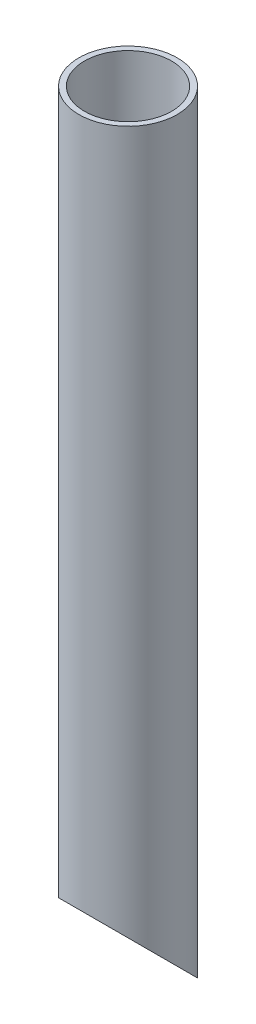
ISO-10303-21;
HEADER;
FILE_DESCRIPTION(('STEP AP214'),'2;1');
FILE_NAME('part.step','',(''),(''),'','','');
FILE_SCHEMA(('AUTOMOTIVE_DESIGN { 1 0 10303 214 1 1 1 1 }'));
ENDSEC;
DATA;
#1=APPLICATION_CONTEXT('core data for automotive mechanical design processes');
#2=APPLICATION_PROTOCOL_DEFINITION('international standard','automotive_design',2000,#1);
#3=PRODUCT_CONTEXT('',#1,'mechanical');
#4=PRODUCT('Part','Part','',(#3));
#5=PRODUCT_RELATED_PRODUCT_CATEGORY('part','',(#4));
#6=PRODUCT_DEFINITION_FORMATION('','',#4);
#7=PRODUCT_DEFINITION_CONTEXT('part definition',#1,'design');
#8=PRODUCT_DEFINITION('design','',#6,#7);
#9=PRODUCT_DEFINITION_SHAPE('','',#8);
#10=(LENGTH_UNIT() NAMED_UNIT(*) SI_UNIT(.MILLI.,.METRE.));
#11=(NAMED_UNIT(*) PLANE_ANGLE_UNIT() SI_UNIT($,.RADIAN.));
#12=(NAMED_UNIT(*) SI_UNIT($,.STERADIAN.) SOLID_ANGLE_UNIT());
#13=UNCERTAINTY_MEASURE_WITH_UNIT(LENGTH_MEASURE(1.E-05),#10,'distance_accuracy_value','');
#14=(GEOMETRIC_REPRESENTATION_CONTEXT(3) GLOBAL_UNCERTAINTY_ASSIGNED_CONTEXT((#13)) GLOBAL_UNIT_ASSIGNED_CONTEXT((#10,
#11,#12)) REPRESENTATION_CONTEXT('',''));
#15=CARTESIAN_POINT('',(0.,0.,0.));
#16=DIRECTION('',(0.,0.,1.));
#17=DIRECTION('',(1.,0.,0.));
#18=AXIS2_PLACEMENT_3D('',#15,#16,#17);
#19=CARTESIAN_POINT('',(0.,304.8,0.));
#20=DIRECTION('',(0.,-1.,0.));
#21=DIRECTION('',(0.,0.,-1.));
#22=AXIS2_PLACEMENT_3D('',#19,#20,#21);
#23=CYLINDRICAL_SURFACE('',#22,16.891);
#24=CARTESIAN_POINT('',(0.,304.8,0.));
#25=DIRECTION('',(0.,1.,0.));
#26=DIRECTION('',(1.,0.,0.));
#27=AXIS2_PLACEMENT_3D('',#24,#25,#26);
#28=CIRCLE('',#27,16.891);
#29=CARTESIAN_POINT('',(16.891,304.8,0.));
#30=VERTEX_POINT('',#29);
#31=EDGE_CURVE('E9',#30,#30,#28,.T.);
#32=ORIENTED_EDGE('',*,*,#31,.T.);
#33=EDGE_LOOP('',(#32));
#34=FACE_BOUND('',#33,.T.);
#35=CARTESIAN_POINT('',(0.,19.0500000000005,0.));
#36=DIRECTION('',(0.,0.707106781186544,-0.707106781186551));
#37=DIRECTION('',(0.,0.707106781186551,0.707106781186544));
#38=AXIS2_PLACEMENT_3D('',#35,#36,#37);
#39=ELLIPSE('',#38,23.8874812820441,16.891);
#40=CARTESIAN_POINT('',(0.,35.9410000000007,16.891));
#41=VERTEX_POINT('',#40);
#42=EDGE_CURVE('E27',#41,#41,#39,.T.);
#43=ORIENTED_EDGE('',*,*,#42,.F.);
#44=EDGE_LOOP('',(#43));
#45=FACE_BOUND('',#44,.T.);
#46=ADVANCED_FACE('F14',(#34,#45),#23,.F.);
#47=CARTESIAN_POINT('',(0.,304.8,0.));
#48=DIRECTION('',(0.,-1.,0.));
#49=DIRECTION('',(0.,0.,-1.));
#50=AXIS2_PLACEMENT_3D('',#47,#48,#49);
#51=CYLINDRICAL_SURFACE('',#50,19.05);
#52=CARTESIAN_POINT('',(0.,304.8,0.));
#53=DIRECTION('',(0.,1.,0.));
#54=DIRECTION('',(1.,0.,0.));
#55=AXIS2_PLACEMENT_3D('',#52,#53,#54);
#56=CIRCLE('',#55,19.05);
#57=CARTESIAN_POINT('',(19.05,304.8,0.));
#58=VERTEX_POINT('',#57);
#59=EDGE_CURVE('E25',#58,#58,#56,.T.);
#60=ORIENTED_EDGE('',*,*,#59,.F.);
#61=EDGE_LOOP('',(#60));
#62=FACE_BOUND('',#61,.T.);
#63=CARTESIAN_POINT('',(0.,19.0500000000005,0.));
#64=DIRECTION('',(0.,0.707106781186544,-0.707106781186551));
#65=DIRECTION('',(0.,0.707106781186551,0.707106781186544));
#66=AXIS2_PLACEMENT_3D('',#63,#64,#65);
#67=ELLIPSE('',#66,26.9407683632076,19.05);
#68=CARTESIAN_POINT('',(0.,38.1000000000007,19.05));
#69=VERTEX_POINT('',#68);
#70=EDGE_CURVE('E17',#69,#69,#67,.T.);
#71=ORIENTED_EDGE('',*,*,#70,.T.);
#72=EDGE_LOOP('',(#71));
#73=FACE_BOUND('',#72,.T.);
#74=ADVANCED_FACE('F35',(#62,#73),#51,.T.);
#75=CARTESIAN_POINT('',(0.,304.8,0.));
#76=DIRECTION('',(0.,1.,0.));
#77=DIRECTION('',(0.,0.,1.));
#78=AXIS2_PLACEMENT_3D('',#75,#76,#77);
#79=PLANE('',#78);
#80=ORIENTED_EDGE('',*,*,#59,.T.);
#81=EDGE_LOOP('',(#80));
#82=FACE_BOUND('',#81,.T.);
#83=ORIENTED_EDGE('',*,*,#31,.F.);
#84=EDGE_LOOP('',(#83));
#85=FACE_BOUND('',#84,.T.);
#86=ADVANCED_FACE('F32',(#82,#85),#79,.T.);
#87=CARTESIAN_POINT('',(-19.05,2.22044604925031E-13,-19.05));
#88=DIRECTION('',(0.,0.707106781186544,-0.707106781186551));
#89=DIRECTION('',(0.,0.707106781186551,0.707106781186544));
#90=AXIS2_PLACEMENT_3D('',#87,#88,#89);
#91=PLANE('',#90);
#92=ORIENTED_EDGE('',*,*,#70,.F.);
#93=EDGE_LOOP('',(#92));
#94=FACE_BOUND('',#93,.T.);
#95=ORIENTED_EDGE('',*,*,#42,.T.);
#96=EDGE_LOOP('',(#95));
#97=FACE_BOUND('',#96,.T.);
#98=ADVANCED_FACE('F40',(#94,#97),#91,.F.);
#99=CLOSED_SHELL('',(#46,#74,#86,#98));
#100=MANIFOLD_SOLID_BREP('B1',#99);
#101=ADVANCED_BREP_SHAPE_REPRESENTATION('',(#18,#100),#14);
#102=SHAPE_DEFINITION_REPRESENTATION(#9,#101);
ENDSEC;
END-ISO-10303-21;
